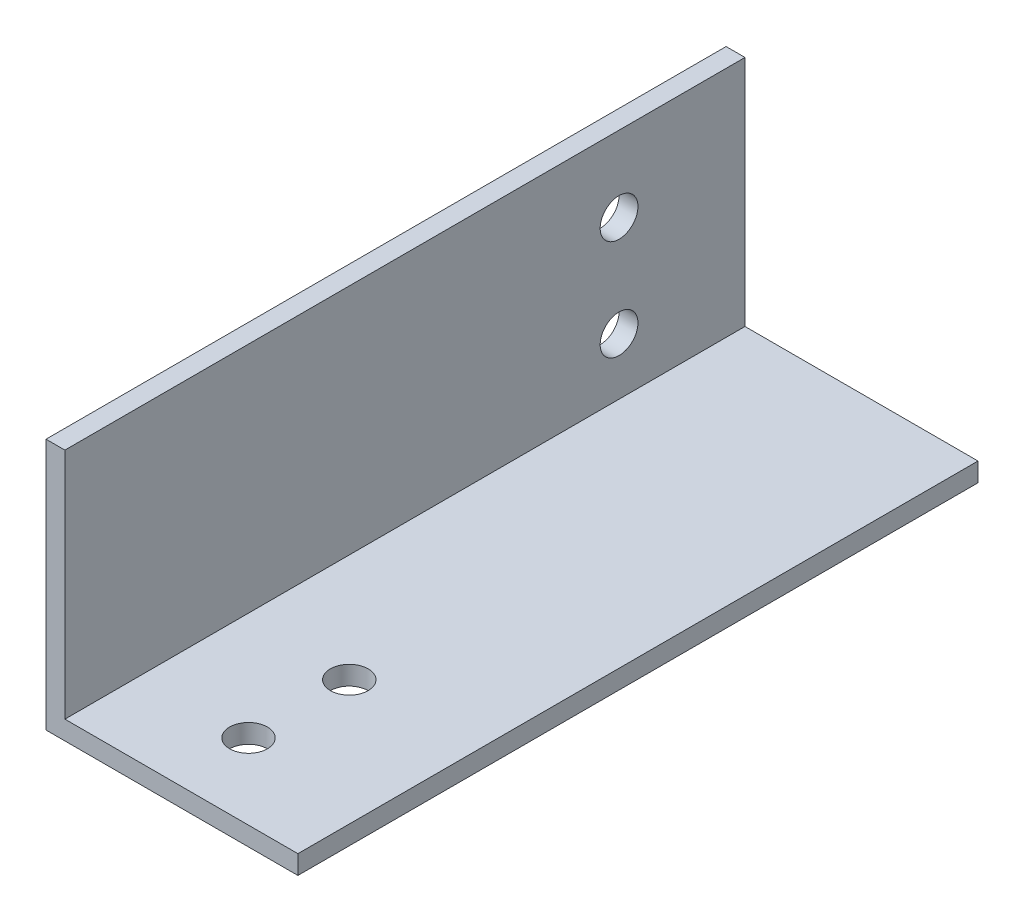
ISO-10303-21;
HEADER;
FILE_DESCRIPTION(('STEP AP214'),'2;1');
FILE_NAME('part.step','',(''),(''),'','','');
FILE_SCHEMA(('AUTOMOTIVE_DESIGN { 1 0 10303 214 1 1 1 1 }'));
ENDSEC;
DATA;
#1=APPLICATION_CONTEXT('core data for automotive mechanical design processes');
#2=APPLICATION_PROTOCOL_DEFINITION('international standard','automotive_design',2000,#1);
#3=PRODUCT_CONTEXT('',#1,'mechanical');
#4=PRODUCT('Part','Part','',(#3));
#5=PRODUCT_RELATED_PRODUCT_CATEGORY('part','',(#4));
#6=PRODUCT_DEFINITION_FORMATION('','',#4);
#7=PRODUCT_DEFINITION_CONTEXT('part definition',#1,'design');
#8=PRODUCT_DEFINITION('design','',#6,#7);
#9=PRODUCT_DEFINITION_SHAPE('','',#8);
#10=(LENGTH_UNIT() NAMED_UNIT(*) SI_UNIT(.MILLI.,.METRE.));
#11=(NAMED_UNIT(*) PLANE_ANGLE_UNIT() SI_UNIT($,.RADIAN.));
#12=(NAMED_UNIT(*) SI_UNIT($,.STERADIAN.) SOLID_ANGLE_UNIT());
#13=UNCERTAINTY_MEASURE_WITH_UNIT(LENGTH_MEASURE(1.E-05),#10,'distance_accuracy_value','');
#14=(GEOMETRIC_REPRESENTATION_CONTEXT(3) GLOBAL_UNCERTAINTY_ASSIGNED_CONTEXT((#13)) GLOBAL_UNIT_ASSIGNED_CONTEXT((#10,
#11,#12)) REPRESENTATION_CONTEXT('',''));
#15=CARTESIAN_POINT('',(0.,0.,0.));
#16=DIRECTION('',(0.,0.,1.));
#17=DIRECTION('',(1.,0.,0.));
#18=AXIS2_PLACEMENT_3D('',#15,#16,#17);
#19=CARTESIAN_POINT('',(-17.2142713590001,3.49808917197452,54.));
#20=DIRECTION('',(0.,-1.,0.));
#21=DIRECTION('',(1.,0.,0.));
#22=AXIS2_PLACEMENT_3D('',#19,#20,#21);
#23=PLANE('',#22);
#24=DIRECTION('',(-1.,0.,0.));
#25=VECTOR('',#24,1.);
#26=CARTESIAN_POINT('',(-17.2142713590001,3.49808917197452,0.));
#27=LINE('',#26,#25);
#28=CARTESIAN_POINT('',(-17.2142713590001,3.49808917197452,0.));
#29=VERTEX_POINT('',#28);
#30=CARTESIAN_POINT('',(-18.7142713590001,3.49808917197452,0.));
#31=VERTEX_POINT('',#30);
#32=EDGE_CURVE('E117',#29,#31,#27,.T.);
#33=ORIENTED_EDGE('',*,*,#32,.T.);
#34=DIRECTION('',(0.,0.,-1.));
#35=VECTOR('',#34,1.);
#36=CARTESIAN_POINT('',(-18.7142713590001,3.49808917197452,54.));
#37=LINE('',#36,#35);
#38=CARTESIAN_POINT('',(-18.7142713590001,3.49808917197452,54.));
#39=VERTEX_POINT('',#38);
#40=EDGE_CURVE('E11',#39,#31,#37,.T.);
#41=ORIENTED_EDGE('',*,*,#40,.F.);
#42=DIRECTION('',(-1.,0.,0.));
#43=VECTOR('',#42,1.);
#44=CARTESIAN_POINT('',(-17.2142713590001,3.49808917197452,54.));
#45=LINE('',#44,#43);
#46=CARTESIAN_POINT('',(-17.2142713590001,3.49808917197452,54.));
#47=VERTEX_POINT('',#46);
#48=EDGE_CURVE('E128',#47,#39,#45,.T.);
#49=ORIENTED_EDGE('',*,*,#48,.F.);
#50=DIRECTION('',(0.,0.,-1.));
#51=VECTOR('',#50,1.);
#52=CARTESIAN_POINT('',(-17.2142713590001,3.49808917197452,54.));
#53=LINE('',#52,#51);
#54=EDGE_CURVE('E113',#47,#29,#53,.T.);
#55=ORIENTED_EDGE('',*,*,#54,.T.);
#56=EDGE_LOOP('',(#33,#41,#49,#55));
#57=FACE_BOUND('',#56,.T.);
#58=ADVANCED_FACE('F31',(#57),#23,.F.);
#59=CARTESIAN_POINT('',(-18.7142713590001,3.49808917197452,54.));
#60=DIRECTION('',(1.,0.,0.));
#61=DIRECTION('',(0.,1.,0.));
#62=AXIS2_PLACEMENT_3D('',#59,#60,#61);
#63=PLANE('',#62);
#64=CARTESIAN_POINT('',(-18.7142713590001,-10.5019108280255,10.));
#65=DIRECTION('',(-1.,0.,0.));
#66=DIRECTION('',(0.,-1.,0.));
#67=AXIS2_PLACEMENT_3D('',#64,#65,#66);
#68=CIRCLE('',#67,1.5);
#69=CARTESIAN_POINT('',(-18.7142713590001,-12.0019108280255,10.));
#70=VERTEX_POINT('',#69);
#71=EDGE_CURVE('E147',#70,#70,#68,.T.);
#72=ORIENTED_EDGE('',*,*,#71,.F.);
#73=EDGE_LOOP('',(#72));
#74=FACE_BOUND('',#73,.T.);
#75=CARTESIAN_POINT('',(-18.7142713590001,-2.50191082802548,10.));
#76=DIRECTION('',(-1.,0.,0.));
#77=DIRECTION('',(0.,-1.,0.));
#78=AXIS2_PLACEMENT_3D('',#75,#76,#77);
#79=CIRCLE('',#78,1.5);
#80=CARTESIAN_POINT('',(-18.7142713590001,-4.00191082802548,10.));
#81=VERTEX_POINT('',#80);
#82=EDGE_CURVE('E136',#81,#81,#79,.T.);
#83=ORIENTED_EDGE('',*,*,#82,.F.);
#84=EDGE_LOOP('',(#83));
#85=FACE_BOUND('',#84,.T.);
#86=DIRECTION('',(0.,-1.,0.));
#87=VECTOR('',#86,1.);
#88=CARTESIAN_POINT('',(-18.7142713590001,3.49808917197452,0.));
#89=LINE('',#88,#87);
#90=CARTESIAN_POINT('',(-18.7142713590001,-16.5019108280255,0.));
#91=VERTEX_POINT('',#90);
#92=EDGE_CURVE('E120',#31,#91,#89,.T.);
#93=ORIENTED_EDGE('',*,*,#92,.T.);
#94=DIRECTION('',(0.,0.,-1.));
#95=VECTOR('',#94,1.);
#96=CARTESIAN_POINT('',(-18.7142713590001,-16.5019108280255,54.));
#97=LINE('',#96,#95);
#98=CARTESIAN_POINT('',(-18.7142713590001,-16.5019108280255,54.));
#99=VERTEX_POINT('',#98);
#100=EDGE_CURVE('E40',#99,#91,#97,.T.);
#101=ORIENTED_EDGE('',*,*,#100,.F.);
#102=DIRECTION('',(0.,-1.,0.));
#103=VECTOR('',#102,1.);
#104=CARTESIAN_POINT('',(-18.7142713590001,3.49808917197452,54.));
#105=LINE('',#104,#103);
#106=EDGE_CURVE('E86',#39,#99,#105,.T.);
#107=ORIENTED_EDGE('',*,*,#106,.F.);
#108=ORIENTED_EDGE('',*,*,#40,.T.);
#109=EDGE_LOOP('',(#93,#101,#107,#108));
#110=FACE_BOUND('',#109,.T.);
#111=ADVANCED_FACE('F160',(#74,#85,#110),#63,.F.);
#112=CARTESIAN_POINT('',(-18.7142713590001,-16.5019108280255,54.));
#113=DIRECTION('',(0.,1.,0.));
#114=DIRECTION('',(0.,0.,1.));
#115=AXIS2_PLACEMENT_3D('',#112,#113,#114);
#116=PLANE('',#115);
#117=CARTESIAN_POINT('',(-8.6336527340336,-16.5019108280255,40.));
#118=DIRECTION('',(0.,1.,0.));
#119=DIRECTION('',(0.,0.,1.));
#120=AXIS2_PLACEMENT_3D('',#117,#118,#119);
#121=CIRCLE('',#120,1.5);
#122=CARTESIAN_POINT('',(-8.6336527340336,-16.5019108280255,41.5));
#123=VERTEX_POINT('',#122);
#124=EDGE_CURVE('E140',#123,#123,#121,.T.);
#125=ORIENTED_EDGE('',*,*,#124,.T.);
#126=EDGE_LOOP('',(#125));
#127=FACE_BOUND('',#126,.T.);
#128=CARTESIAN_POINT('',(-8.6336527340336,-16.5019108280255,48.));
#129=DIRECTION('',(0.,1.,0.));
#130=DIRECTION('',(0.,0.,1.));
#131=AXIS2_PLACEMENT_3D('',#128,#129,#130);
#132=CIRCLE('',#131,1.5);
#133=CARTESIAN_POINT('',(-8.6336527340336,-16.5019108280255,49.5));
#134=VERTEX_POINT('',#133);
#135=EDGE_CURVE('E121',#134,#134,#132,.T.);
#136=ORIENTED_EDGE('',*,*,#135,.T.);
#137=EDGE_LOOP('',(#136));
#138=FACE_BOUND('',#137,.T.);
#139=DIRECTION('',(1.,0.,0.));
#140=VECTOR('',#139,1.);
#141=CARTESIAN_POINT('',(-18.7142713590001,-16.5019108280255,0.));
#142=LINE('',#141,#140);
#143=CARTESIAN_POINT('',(1.28572864099994,-16.5019108280255,0.));
#144=VERTEX_POINT('',#143);
#145=EDGE_CURVE('E123',#91,#144,#142,.T.);
#146=ORIENTED_EDGE('',*,*,#145,.T.);
#147=DIRECTION('',(0.,0.,-1.));
#148=VECTOR('',#147,1.);
#149=CARTESIAN_POINT('',(1.28572864099994,-16.5019108280255,54.));
#150=LINE('',#149,#148);
#151=CARTESIAN_POINT('',(1.28572864099994,-16.5019108280255,54.));
#152=VERTEX_POINT('',#151);
#153=EDGE_CURVE('E108',#152,#144,#150,.T.);
#154=ORIENTED_EDGE('',*,*,#153,.F.);
#155=DIRECTION('',(1.,0.,0.));
#156=VECTOR('',#155,1.);
#157=CARTESIAN_POINT('',(-18.7142713590001,-16.5019108280255,54.));
#158=LINE('',#157,#156);
#159=EDGE_CURVE('E99',#99,#152,#158,.T.);
#160=ORIENTED_EDGE('',*,*,#159,.F.);
#161=ORIENTED_EDGE('',*,*,#100,.T.);
#162=EDGE_LOOP('',(#146,#154,#160,#161));
#163=FACE_BOUND('',#162,.T.);
#164=ADVANCED_FACE('F163',(#127,#138,#163),#116,.F.);
#165=CARTESIAN_POINT('',(1.28572864099994,-16.5019108280255,54.));
#166=DIRECTION('',(-1.,0.,0.));
#167=DIRECTION('',(0.,0.,1.));
#168=AXIS2_PLACEMENT_3D('',#165,#166,#167);
#169=PLANE('',#168);
#170=DIRECTION('',(0.,1.,0.));
#171=VECTOR('',#170,1.);
#172=CARTESIAN_POINT('',(1.28572864099994,-16.5019108280255,0.));
#173=LINE('',#172,#171);
#174=CARTESIAN_POINT('',(1.28572864099994,-15.0019108280255,0.));
#175=VERTEX_POINT('',#174);
#176=EDGE_CURVE('E107',#144,#175,#173,.T.);
#177=ORIENTED_EDGE('',*,*,#176,.T.);
#178=DIRECTION('',(0.,0.,-1.));
#179=VECTOR('',#178,1.);
#180=CARTESIAN_POINT('',(1.28572864099994,-15.0019108280255,54.));
#181=LINE('',#180,#179);
#182=CARTESIAN_POINT('',(1.28572864099994,-15.0019108280255,54.));
#183=VERTEX_POINT('',#182);
#184=EDGE_CURVE('E104',#183,#175,#181,.T.);
#185=ORIENTED_EDGE('',*,*,#184,.F.);
#186=DIRECTION('',(0.,1.,0.));
#187=VECTOR('',#186,1.);
#188=CARTESIAN_POINT('',(1.28572864099994,-16.5019108280255,54.));
#189=LINE('',#188,#187);
#190=EDGE_CURVE('E93',#152,#183,#189,.T.);
#191=ORIENTED_EDGE('',*,*,#190,.F.);
#192=ORIENTED_EDGE('',*,*,#153,.T.);
#193=EDGE_LOOP('',(#177,#185,#191,#192));
#194=FACE_BOUND('',#193,.T.);
#195=ADVANCED_FACE('F105',(#194),#169,.F.);
#196=CARTESIAN_POINT('',(1.28572864099994,-15.0019108280255,54.));
#197=DIRECTION('',(0.,-1.,0.));
#198=DIRECTION('',(1.,0.,0.));
#199=AXIS2_PLACEMENT_3D('',#196,#197,#198);
#200=PLANE('',#199);
#201=CARTESIAN_POINT('',(-8.6336527340336,-15.0019108280255,40.));
#202=DIRECTION('',(0.,1.,0.));
#203=DIRECTION('',(-1.,0.,0.));
#204=AXIS2_PLACEMENT_3D('',#201,#202,#203);
#205=CIRCLE('',#204,1.5);
#206=CARTESIAN_POINT('',(-10.1336527340336,-15.0019108280255,40.));
#207=VERTEX_POINT('',#206);
#208=EDGE_CURVE('E135',#207,#207,#205,.T.);
#209=ORIENTED_EDGE('',*,*,#208,.F.);
#210=EDGE_LOOP('',(#209));
#211=FACE_BOUND('',#210,.T.);
#212=CARTESIAN_POINT('',(-8.6336527340336,-15.0019108280255,48.));
#213=DIRECTION('',(0.,1.,0.));
#214=DIRECTION('',(-1.,0.,0.));
#215=AXIS2_PLACEMENT_3D('',#212,#213,#214);
#216=CIRCLE('',#215,1.5);
#217=CARTESIAN_POINT('',(-10.1336527340336,-15.0019108280255,48.));
#218=VERTEX_POINT('',#217);
#219=EDGE_CURVE('E152',#218,#218,#216,.T.);
#220=ORIENTED_EDGE('',*,*,#219,.F.);
#221=EDGE_LOOP('',(#220));
#222=FACE_BOUND('',#221,.T.);
#223=DIRECTION('',(-1.,0.,0.));
#224=VECTOR('',#223,1.);
#225=CARTESIAN_POINT('',(1.28572864099994,-15.0019108280255,0.));
#226=LINE('',#225,#224);
#227=CARTESIAN_POINT('',(-17.2142713590001,-15.0019108280255,0.));
#228=VERTEX_POINT('',#227);
#229=EDGE_CURVE('E72',#175,#228,#226,.T.);
#230=ORIENTED_EDGE('',*,*,#229,.T.);
#231=DIRECTION('',(0.,0.,-1.));
#232=VECTOR('',#231,1.);
#233=CARTESIAN_POINT('',(-17.2142713590001,-15.0019108280255,54.));
#234=LINE('',#233,#232);
#235=CARTESIAN_POINT('',(-17.2142713590001,-15.0019108280255,54.));
#236=VERTEX_POINT('',#235);
#237=EDGE_CURVE('E109',#236,#228,#234,.T.);
#238=ORIENTED_EDGE('',*,*,#237,.F.);
#239=DIRECTION('',(-1.,0.,0.));
#240=VECTOR('',#239,1.);
#241=CARTESIAN_POINT('',(1.28572864099994,-15.0019108280255,54.));
#242=LINE('',#241,#240);
#243=EDGE_CURVE('E97',#183,#236,#242,.T.);
#244=ORIENTED_EDGE('',*,*,#243,.F.);
#245=ORIENTED_EDGE('',*,*,#184,.T.);
#246=EDGE_LOOP('',(#230,#238,#244,#245));
#247=FACE_BOUND('',#246,.T.);
#248=ADVANCED_FACE('F111',(#211,#222,#247),#200,.F.);
#249=CARTESIAN_POINT('',(-17.2142713590001,-15.0019108280255,54.));
#250=DIRECTION('',(-1.,0.,0.));
#251=DIRECTION('',(0.,0.,1.));
#252=AXIS2_PLACEMENT_3D('',#249,#250,#251);
#253=PLANE('',#252);
#254=CARTESIAN_POINT('',(-17.2142713590001,-10.5019108280255,10.));
#255=DIRECTION('',(-1.,0.,0.));
#256=DIRECTION('',(0.,0.,1.));
#257=AXIS2_PLACEMENT_3D('',#254,#255,#256);
#258=CIRCLE('',#257,1.5);
#259=CARTESIAN_POINT('',(-17.2142713590001,-10.5019108280255,11.5));
#260=VERTEX_POINT('',#259);
#261=EDGE_CURVE('E34',#260,#260,#258,.T.);
#262=ORIENTED_EDGE('',*,*,#261,.T.);
#263=EDGE_LOOP('',(#262));
#264=FACE_BOUND('',#263,.T.);
#265=CARTESIAN_POINT('',(-17.2142713590001,-2.50191082802548,10.));
#266=DIRECTION('',(-1.,0.,0.));
#267=DIRECTION('',(0.,0.,1.));
#268=AXIS2_PLACEMENT_3D('',#265,#266,#267);
#269=CIRCLE('',#268,1.5);
#270=CARTESIAN_POINT('',(-17.2142713590001,-2.50191082802548,11.5));
#271=VERTEX_POINT('',#270);
#272=EDGE_CURVE('E133',#271,#271,#269,.T.);
#273=ORIENTED_EDGE('',*,*,#272,.T.);
#274=EDGE_LOOP('',(#273));
#275=FACE_BOUND('',#274,.T.);
#276=DIRECTION('',(0.,1.,0.));
#277=VECTOR('',#276,1.);
#278=CARTESIAN_POINT('',(-17.2142713590001,-15.0019108280255,0.));
#279=LINE('',#278,#277);
#280=EDGE_CURVE('E78',#228,#29,#279,.T.);
#281=ORIENTED_EDGE('',*,*,#280,.T.);
#282=ORIENTED_EDGE('',*,*,#54,.F.);
#283=DIRECTION('',(0.,1.,0.));
#284=VECTOR('',#283,1.);
#285=CARTESIAN_POINT('',(-17.2142713590001,-15.0019108280255,54.));
#286=LINE('',#285,#284);
#287=EDGE_CURVE('E49',#236,#47,#286,.T.);
#288=ORIENTED_EDGE('',*,*,#287,.F.);
#289=ORIENTED_EDGE('',*,*,#237,.T.);
#290=EDGE_LOOP('',(#281,#282,#288,#289));
#291=FACE_BOUND('',#290,.T.);
#292=ADVANCED_FACE('F168',(#264,#275,#291),#253,.F.);
#293=CARTESIAN_POINT('',(-18.7142713590001,3.49808917197452,54.));
#294=DIRECTION('',(0.,0.,1.));
#295=DIRECTION('',(1.,0.,0.));
#296=AXIS2_PLACEMENT_3D('',#293,#294,#295);
#297=PLANE('',#296);
#298=ORIENTED_EDGE('',*,*,#48,.T.);
#299=ORIENTED_EDGE('',*,*,#106,.T.);
#300=ORIENTED_EDGE('',*,*,#159,.T.);
#301=ORIENTED_EDGE('',*,*,#190,.T.);
#302=ORIENTED_EDGE('',*,*,#243,.T.);
#303=ORIENTED_EDGE('',*,*,#287,.T.);
#304=EDGE_LOOP('',(#298,#299,#300,#301,#302,#303));
#305=FACE_BOUND('',#304,.T.);
#306=ADVANCED_FACE('F95',(#305),#297,.T.);
#307=CARTESIAN_POINT('',(-18.7142713590001,3.49808917197452,0.));
#308=DIRECTION('',(0.,0.,1.));
#309=DIRECTION('',(1.,0.,0.));
#310=AXIS2_PLACEMENT_3D('',#307,#308,#309);
#311=PLANE('',#310);
#312=ORIENTED_EDGE('',*,*,#32,.F.);
#313=ORIENTED_EDGE('',*,*,#280,.F.);
#314=ORIENTED_EDGE('',*,*,#229,.F.);
#315=ORIENTED_EDGE('',*,*,#176,.F.);
#316=ORIENTED_EDGE('',*,*,#145,.F.);
#317=ORIENTED_EDGE('',*,*,#92,.F.);
#318=EDGE_LOOP('',(#312,#313,#314,#315,#316,#317));
#319=FACE_BOUND('',#318,.T.);
#320=ADVANCED_FACE('F166',(#319),#311,.F.);
#321=CARTESIAN_POINT('',(-8.6336527340336,-35.0019108280255,48.));
#322=DIRECTION('',(0.,1.,0.));
#323=DIRECTION('',(-1.,0.,0.));
#324=AXIS2_PLACEMENT_3D('',#321,#322,#323);
#325=CYLINDRICAL_SURFACE('',#324,1.5);
#326=ORIENTED_EDGE('',*,*,#219,.T.);
#327=EDGE_LOOP('',(#326));
#328=FACE_BOUND('',#327,.T.);
#329=ORIENTED_EDGE('',*,*,#135,.F.);
#330=EDGE_LOOP('',(#329));
#331=FACE_BOUND('',#330,.T.);
#332=ADVANCED_FACE('F212',(#328,#331),#325,.F.);
#333=CARTESIAN_POINT('',(-8.6336527340336,-35.0019108280255,40.));
#334=DIRECTION('',(0.,1.,0.));
#335=DIRECTION('',(-1.,0.,0.));
#336=AXIS2_PLACEMENT_3D('',#333,#334,#335);
#337=CYLINDRICAL_SURFACE('',#336,1.5);
#338=ORIENTED_EDGE('',*,*,#208,.T.);
#339=EDGE_LOOP('',(#338));
#340=FACE_BOUND('',#339,.T.);
#341=ORIENTED_EDGE('',*,*,#124,.F.);
#342=EDGE_LOOP('',(#341));
#343=FACE_BOUND('',#342,.T.);
#344=ADVANCED_FACE('F217',(#340,#343),#337,.F.);
#345=CARTESIAN_POINT('',(-8.71427135900006,-2.50191082802547,10.));
#346=DIRECTION('',(-1.,0.,0.));
#347=DIRECTION('',(0.,-1.,0.));
#348=AXIS2_PLACEMENT_3D('',#345,#346,#347);
#349=CYLINDRICAL_SURFACE('',#348,1.5);
#350=ORIENTED_EDGE('',*,*,#82,.T.);
#351=EDGE_LOOP('',(#350));
#352=FACE_BOUND('',#351,.T.);
#353=ORIENTED_EDGE('',*,*,#272,.F.);
#354=EDGE_LOOP('',(#353));
#355=FACE_BOUND('',#354,.T.);
#356=ADVANCED_FACE('F228',(#352,#355),#349,.F.);
#357=CARTESIAN_POINT('',(-8.71427135900006,-10.5019108280255,10.));
#358=DIRECTION('',(-1.,0.,0.));
#359=DIRECTION('',(0.,-1.,0.));
#360=AXIS2_PLACEMENT_3D('',#357,#358,#359);
#361=CYLINDRICAL_SURFACE('',#360,1.5);
#362=ORIENTED_EDGE('',*,*,#71,.T.);
#363=EDGE_LOOP('',(#362));
#364=FACE_BOUND('',#363,.T.);
#365=ORIENTED_EDGE('',*,*,#261,.F.);
#366=EDGE_LOOP('',(#365));
#367=FACE_BOUND('',#366,.T.);
#368=ADVANCED_FACE('F248',(#364,#367),#361,.F.);
#369=CLOSED_SHELL('',(#58,#111,#164,#195,#248,#292,#306,#320,#332,#344,#356,#368));
#370=MANIFOLD_SOLID_BREP('B2',#369);
#371=ADVANCED_BREP_SHAPE_REPRESENTATION('',(#18,#370),#14);
#372=SHAPE_DEFINITION_REPRESENTATION(#9,#371);
ENDSEC;
END-ISO-10303-21;
